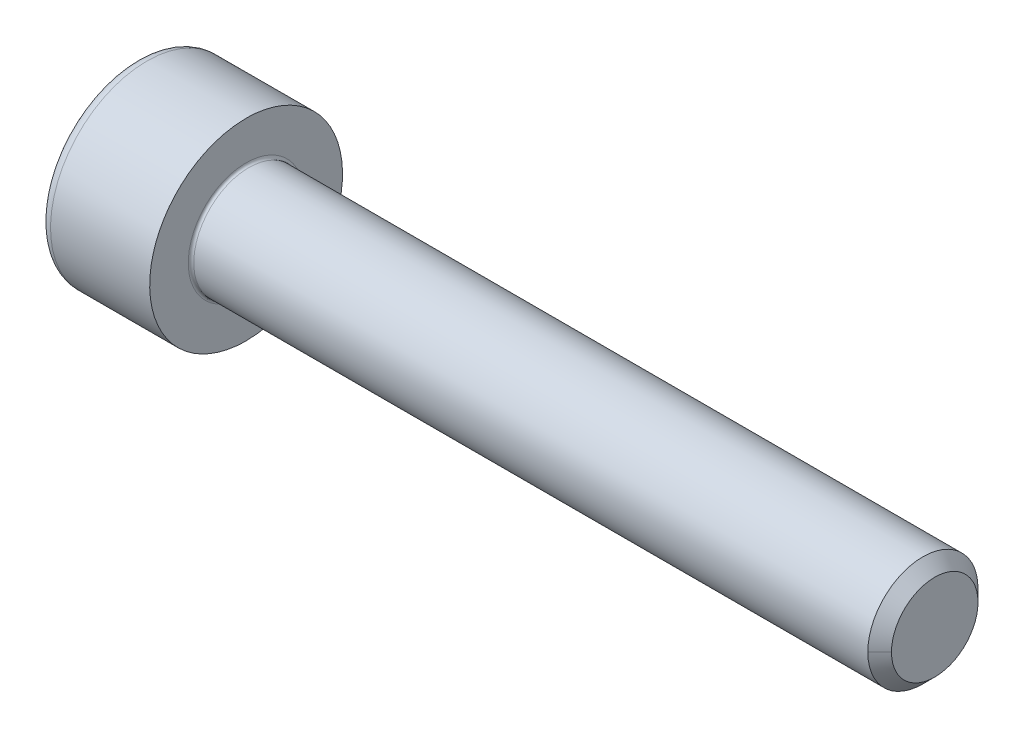
ISO-10303-21;
HEADER;
FILE_DESCRIPTION(('STEP AP214'),'2;1');
FILE_NAME('part.step','',(''),(''),'','','');
FILE_SCHEMA(('AUTOMOTIVE_DESIGN { 1 0 10303 214 1 1 1 1 }'));
ENDSEC;
DATA;
#1=APPLICATION_CONTEXT('core data for automotive mechanical design processes');
#2=APPLICATION_PROTOCOL_DEFINITION('international standard','automotive_design',2000,#1);
#3=PRODUCT_CONTEXT('',#1,'mechanical');
#4=PRODUCT('Part','Part','',(#3));
#5=PRODUCT_RELATED_PRODUCT_CATEGORY('part','',(#4));
#6=PRODUCT_DEFINITION_FORMATION('','',#4);
#7=PRODUCT_DEFINITION_CONTEXT('part definition',#1,'design');
#8=PRODUCT_DEFINITION('design','',#6,#7);
#9=PRODUCT_DEFINITION_SHAPE('','',#8);
#10=(LENGTH_UNIT() NAMED_UNIT(*) SI_UNIT(.MILLI.,.METRE.));
#11=(NAMED_UNIT(*) PLANE_ANGLE_UNIT() SI_UNIT($,.RADIAN.));
#12=(NAMED_UNIT(*) SI_UNIT($,.STERADIAN.) SOLID_ANGLE_UNIT());
#13=UNCERTAINTY_MEASURE_WITH_UNIT(LENGTH_MEASURE(1.E-05),#10,'distance_accuracy_value','');
#14=(GEOMETRIC_REPRESENTATION_CONTEXT(3) GLOBAL_UNCERTAINTY_ASSIGNED_CONTEXT((#13)) GLOBAL_UNIT_ASSIGNED_CONTEXT((#10,
#11,#12)) REPRESENTATION_CONTEXT('',''));
#15=CARTESIAN_POINT('',(0.,0.,0.));
#16=DIRECTION('',(0.,0.,1.));
#17=DIRECTION('',(1.,0.,0.));
#18=AXIS2_PLACEMENT_3D('',#15,#16,#17);
#19=CARTESIAN_POINT('',(-1.,0.,0.));
#20=CARTESIAN_POINT('',(-2.005999996,0.,1.742443106));
#21=(BOUNDED_CURVE() B_SPLINE_CURVE(1,(#19,#20),.UNSPECIFIED.,.F.,
.F.) B_SPLINE_CURVE_WITH_KNOTS((2,2),(0.,1.),
.UNSPECIFIED.) CURVE() GEOMETRIC_REPRESENTATION_ITEM() RATIONAL_B_SPLINE_CURVE((1.,1.)) REPRESENTATION_ITEM(''));
#22=CARTESIAN_POINT('',(997.994,0.,0.));
#23=DIRECTION('',(-1.,0.,0.));
#24=AXIS1_PLACEMENT('',#22,#23);
#25=SURFACE_OF_REVOLUTION('',#21,#24);
#26=CARTESIAN_POINT('',(-1.,0.,0.));
#27=VERTEX_POINT('',#26);
#28=VERTEX_LOOP('',#27);
#29=FACE_BOUND('',#28,.T.);
#30=CARTESIAN_POINT('',(-1.999999988825,-1.5,-0.866025366094797));
#31=CARTESIAN_POINT('',(-1.98388427411064,-1.5,-0.810191489178342));
#32=CARTESIAN_POINT('',(-1.96883726220968,-1.5,-0.754027140575367));
#33=CARTESIAN_POINT('',(-1.94132338547913,-1.5,-0.641014476879999));
#34=CARTESIAN_POINT('',(-1.9288590897329,-1.5,-0.584165539709616));
#35=CARTESIAN_POINT('',(-1.9070072802246,-1.5,-0.469976774400273));
#36=CARTESIAN_POINT('',(-1.89761413319003,-1.5,-0.412638045248085));
#37=CARTESIAN_POINT('',(-1.88230126175624,-1.5,-0.297500282732238));
#38=CARTESIAN_POINT('',(-1.87638124423699,-1.5,-0.23970128863077));
#39=CARTESIAN_POINT('',(-1.86701324338038,-1.5,-0.104714620713106));
#40=CARTESIAN_POINT('',(-1.86502429509298,-1.5,-0.0274188014013972));
#41=CARTESIAN_POINT('',(-1.8679815164406,-1.5,0.127055332262541));
#42=CARTESIAN_POINT('',(-1.87292979645163,-1.5,0.204233603704438));
#43=CARTESIAN_POINT('',(-1.88925859295073,-1.5,0.357837347878237));
#44=CARTESIAN_POINT('',(-1.90063515529884,-1.5,0.434263254027111));
#45=CARTESIAN_POINT('',(-1.92885727236987,-1.5,0.586093369356609));
#46=CARTESIAN_POINT('',(-1.94570378781158,-1.5,0.661497396633531));
#47=CARTESIAN_POINT('',(-1.97026760123469,-1.5,0.758048793201888));
#48=CARTESIAN_POINT('',(-1.97597971174807,-1.5,0.779726485656331));
#49=CARTESIAN_POINT('',(-1.98774144185459,-1.5,0.822959483365519));
#50=CARTESIAN_POINT('',(-1.99379060647347,-1.5,0.844514912309468));
#51=CARTESIAN_POINT('',(-2.00000000500994,-1.5,0.866025422161067));
#52=B_SPLINE_CURVE_WITH_KNOTS('',3,(#30,#31,#32,#33,#34,#35,#36,#37,#38,#39,#40,#41,#42,#43,#44,
#45,#46,#47,#48,#49,#50,#51),.UNSPECIFIED.,.F.,.F.,(4,2,2,2,2,2,2,2,2,2,4),(0.,
0.174360344837175,0.348893305759137,0.523104308736066,0.697300606795078,0.928942731977418,
1.16065534036299,1.39222557351052,1.62383650066837,1.6910881985869,1.75825121782282),.UNSPECIFIED.);
#53=CARTESIAN_POINT('',(-1.99999999692329,-1.50000000789458,-0.866025380474286));
#54=VERTEX_POINT('',#53);
#55=CARTESIAN_POINT('',(-1.99999998782495,-1.49999998368972,0.866025413416744));
#56=VERTEX_POINT('',#55);
#57=EDGE_CURVE('E113',#54,#56,#52,.T.);
#58=ORIENTED_EDGE('',*,*,#57,.T.);
#59=CARTESIAN_POINT('',(-1.99999998892486,-1.49999996747271,0.866025422779641));
#60=CARTESIAN_POINT('',(-1.98388427421516,-1.45164641167563,0.893942361242306));
#61=CARTESIAN_POINT('',(-1.96883726231892,-1.40300665900288,0.922024535548226));
#62=CARTESIAN_POINT('',(-1.94132338559778,-1.30513482130235,0.978530867404776));
#63=CARTESIAN_POINT('',(-1.92885908985622,-1.25590219753923,1.0069553359944));
#64=CARTESIAN_POINT('',(-1.90700728035376,-1.15701182594927,1.06404971866634));
#65=CARTESIAN_POINT('',(-1.89761413332126,-1.10735502987275,1.09271908325535));
#66=CARTESIAN_POINT('',(-1.88230126189328,-1.00764280257917,1.15028796453912));
#67=CARTESIAN_POINT('',(-1.87638124437775,-0.957587405364167,1.17918746160279));
#68=CARTESIAN_POINT('',(-1.86701324353106,-0.840685521745317,1.24668079559571));
#69=CARTESIAN_POINT('',(-1.86502429525114,-0.773745378595099,1.2853287052727));
#70=CARTESIAN_POINT('',(-1.86798151661723,-0.639966854574949,1.36256577214675));
#71=CARTESIAN_POINT('',(-1.87292979663929,-0.573128510866455,1.40115490788864));
#72=CARTESIAN_POINT('',(-1.88925859316082,-0.440103766273083,1.47795678000762));
#73=CARTESIAN_POINT('',(-1.9006351555188,-0.373916990037949,1.51616973309328));
#74=CARTESIAN_POINT('',(-1.92885727260821,-0.242428253098442,1.59208479077961));
#75=CARTESIAN_POINT('',(-1.94570378805829,-0.177126449927273,1.62978680442843));
#76=CARTESIAN_POINT('',(-1.97026760040756,-0.0935104914155066,1.67806250059576));
#77=CARTESIAN_POINT('',(-1.9759797097672,-0.0747370627259536,1.68890134470599));
#78=CARTESIAN_POINT('',(-1.98774143743871,-0.0372961957295007,1.71051783935046));
#79=CARTESIAN_POINT('',(-1.99379060077658,-0.0186286503046706,1.72129555172928));
#80=CARTESIAN_POINT('',(-1.99999999797405,-5.93974909207974E-09,1.73205080457068));
#81=B_SPLINE_CURVE_WITH_KNOTS('',3,(#59,#60,#61,#62,#63,#64,#65,#66,#67,#68,#69,#70,#71,#72,#73,
#74,#75,#76,#77,#78,#79,#80),.UNSPECIFIED.,.F.,.F.,(4,2,2,2,2,2,2,2,2,2,4),(0.,
0.174360344828818,0.348893305742674,0.523104308763315,0.697300606866122,0.928942732131166,
1.16065534060084,1.39222557377756,1.62383650095881,1.69108818570207,1.75825119179746),.UNSPECIFIED.);
#82=CARTESIAN_POINT('',(-1.99999999764269,2.96799540127448E-09,1.73205080628643));
#83=VERTEX_POINT('',#82);
#84=EDGE_CURVE('E109',#56,#83,#81,.T.);
#85=ORIENTED_EDGE('',*,*,#84,.T.);
#86=CARTESIAN_POINT('',(-1.9999999984256,5.93599040248426E-09,1.73205080457285));
#87=CARTESIAN_POINT('',(-1.98388428317016,0.0483535620385735,1.70413386593283));
#88=CARTESIAN_POINT('',(-1.96883727070557,0.0969933150186117,1.67605169144851));
#89=CARTESIAN_POINT('',(-1.94132339281138,0.194865153347467,1.61954535922722));
#90=CARTESIAN_POINT('',(-1.92885909646517,0.244097777431653,1.59112089045123));
#91=CARTESIAN_POINT('',(-1.90700728572809,0.342988149688634,1.53402650739219));
#92=CARTESIAN_POINT('',(-1.89761413806593,0.392644946111129,1.50535714260242));
#93=CARTESIAN_POINT('',(-1.88230126537747,0.492357174126329,1.4477882609));
#94=CARTESIAN_POINT('',(-1.87638124723109,0.542412571716971,1.41888876361845));
#95=CARTESIAN_POINT('',(-1.86701324502738,0.659314455291488,1.35139542964876));
#96=CARTESIAN_POINT('',(-1.86502429593639,0.726254598029126,1.31274752020862));
#97=CARTESIAN_POINT('',(-1.8679815156204,0.860033121288683,1.23551045377099));
#98=CARTESIAN_POINT('',(-1.87292979477107,0.926871464649191,1.19692131822866));
#99=CARTESIAN_POINT('',(-1.88925858957895,1.05989620861809,1.12011944646753));
#100=CARTESIAN_POINT('',(-1.90063515109587,1.12608298457658,1.08190649354025));
#101=CARTESIAN_POINT('',(-1.92885726658604,1.25757172099813,1.00599143615031));
#102=CARTESIAN_POINT('',(-1.94570378127822,1.32287352392794,0.968289422639504));
#103=CARTESIAN_POINT('',(-1.97026759510935,1.40648949029337,0.920013721936166));
#104=CARTESIAN_POINT('',(-1.97597970682344,1.42526292703461,0.909174873176919));
#105=CARTESIAN_POINT('',(-1.98774143949462,1.46270381004559,0.887558369285698));
#106=CARTESIAN_POINT('',(-1.99379060547717,1.48137136343338,0.876780652309082));
#107=CARTESIAN_POINT('',(-2.00000000545143,1.50000001572782,0.866025394889192));
#108=B_SPLINE_CURVE_WITH_KNOTS('',3,(#86,#87,#88,#89,#90,#91,#92,#93,#94,#95,#96,#97,#98,#99,
#100,#101,#102,#103,#104,#105,#106,#107),.UNSPECIFIED.,.F.,.F.,(4,2,2,2,2,2,2,2,2,2,4),(0.,
0.174360346301618,0.348893308693771,0.52310431320544,0.697300612796816,0.928942736706048,
1.1606553438073,1.39222557566018,1.62383650152796,1.69108821504016,1.75825124983545),.UNSPECIFIED.);
#109=CARTESIAN_POINT('',(-1.99999998797798,1.5,0.866025385099705));
#110=VERTEX_POINT('',#109);
#111=EDGE_CURVE('E92',#83,#110,#108,.T.);
#112=ORIENTED_EDGE('',*,*,#111,.T.);
#113=CARTESIAN_POINT('',(-1.99999998923092,1.5,0.866025365941079));
#114=CARTESIAN_POINT('',(-1.98388427451986,1.5,0.810191489053593));
#115=CARTESIAN_POINT('',(-1.96883726262161,1.5,0.754027140479678));
#116=CARTESIAN_POINT('',(-1.94132338589499,1.5,0.64101447684253));
#117=CARTESIAN_POINT('',(-1.92885909014996,1.5,0.584165539701308));
#118=CARTESIAN_POINT('',(-1.90700728063975,1.5,0.469976774437452));
#119=CARTESIAN_POINT('',(-1.89761413360275,1.5,0.412638045301457));
#120=CARTESIAN_POINT('',(-1.88230126216352,1.5,0.297500282817762));
#121=CARTESIAN_POINT('',(-1.87638124464125,1.5,0.239701288732254));
#122=CARTESIAN_POINT('',(-1.86701324377786,1.5,0.104714620864367));
#123=CARTESIAN_POINT('',(-1.86502429548537,1.5,0.0274188015864669));
#124=CARTESIAN_POINT('',(-1.8679815168201,1.5,-0.12705533201076));
#125=CARTESIAN_POINT('',(-1.87292979682335,1.5,-0.204233603419755));
#126=CARTESIAN_POINT('',(-1.88925859330368,1.5,-0.357837347514858));
#127=CARTESIAN_POINT('',(-1.90063515563966,1.5,-0.434263253618061));
#128=CARTESIAN_POINT('',(-1.9288572726839,1.5,-0.586093368856159));
#129=CARTESIAN_POINT('',(-1.94570378811084,1.5,-0.661497396087368));
#130=CARTESIAN_POINT('',(-1.97026760074137,1.5,-0.758048789559621));
#131=CARTESIAN_POINT('',(-1.97597971042608,1.5,-0.779726478977909));
#132=CARTESIAN_POINT('',(-1.98774143878437,1.5,-0.822959470648941));
#133=CARTESIAN_POINT('',(-1.99379060248387,1.5,-0.844514896590837));
#134=CARTESIAN_POINT('',(-2.00000000005964,1.5,-0.866025403452887));
#135=B_SPLINE_CURVE_WITH_KNOTS('',3,(#113,#114,#115,#116,#117,#118,#119,#120,#121,#122,#123,
#124,#125,#126,#127,#128,#129,#130,#131,#132,#133,#134),.UNSPECIFIED.,.F.,.F.,(4,2,2,2,2,2,2,2,
2,2,4),(0.,0.174360344750907,0.348893305586688,0.523104308516857,0.697300606529161,
0.928942731610677,1.16065533989623,1.39222557290333,1.62383649991651,1.69108818839458,
1.758251198215),.UNSPECIFIED.);
#136=CARTESIAN_POINT('',(-1.99999999991955,1.49999999996334,-0.866025404021169));
#137=VERTEX_POINT('',#136);
#138=EDGE_CURVE('E569',#110,#137,#135,.T.);
#139=ORIENTED_EDGE('',*,*,#138,.T.);
#140=CARTESIAN_POINT('',(-2.00000000019314,1.49999999992667,-0.866025404042337));
#141=CARTESIAN_POINT('',(-1.98388428483218,1.45164644376261,-0.893942342715188));
#142=CARTESIAN_POINT('',(-1.96883727225752,1.40300669072079,-0.922024517232485));
#143=CARTESIAN_POINT('',(-1.94132339413591,1.30513485226571,-0.978530849521243));
#144=CARTESIAN_POINT('',(-1.92885909767233,1.25590222811708,-1.00695531833172));
#145=CARTESIAN_POINT('',(-1.90700728669417,1.15701185572053,-1.06404970146588));
#146=CARTESIAN_POINT('',(-1.8976141389087,1.10735505922284,-1.09271906629631));
#147=CARTESIAN_POINT('',(-1.88230126597394,1.00764283105143,-1.1502879480834));
#148=CARTESIAN_POINT('',(-1.87638124770456,0.957587433379773,-1.17918744540897));
#149=CARTESIAN_POINT('',(-1.86701324523704,0.840685549794599,-1.24668077937834));
#150=CARTESIAN_POINT('',(-1.8650242959891,0.773745407125871,-1.285328688775));
#151=CARTESIAN_POINT('',(-1.867981515349,0.639966883991539,-1.36256575513294));
#152=CARTESIAN_POINT('',(-1.87292979433245,0.573128540687341,-1.40115489063907));
#153=CARTESIAN_POINT('',(-1.88925858881171,0.440103796823718,-1.47795676233207));
#154=CARTESIAN_POINT('',(-1.90063515016686,0.373917020914163,-1.51616971522743));
#155=CARTESIAN_POINT('',(-1.92885726534937,0.242428284584089,-1.59208477255729));
#156=CARTESIAN_POINT('',(-1.94570377989565,0.177126481696809,-1.62978678603993));
#157=CARTESIAN_POINT('',(-1.97026759358927,0.0935105152536638,-1.67806248678352));
#158=CARTESIAN_POINT('',(-1.97597970530568,0.074737078393651,-1.6889013356103));
#159=CARTESIAN_POINT('',(-1.98774143798774,0.0372961951460656,-1.71051783963606));
#160=CARTESIAN_POINT('',(-1.99379060397882,0.0186286416404332,-1.72129555667968));
#161=CARTESIAN_POINT('',(-2.00000000396437,-1.07713453244131E-08,-1.73205081416628));
#162=B_SPLINE_CURVE_WITH_KNOTS('',3,(#140,#141,#142,#143,#144,#145,#146,#147,#148,#149,#150,
#151,#152,#153,#154,#155,#156,#157,#158,#159,#160,#161),.UNSPECIFIED.,.F.,.F.,(4,2,2,2,2,2,2,2,
2,2,4),(0.,0.174360346590282,0.348893309272312,0.52310431409702,0.697300614000983,
0.928942737679676,1.16065534454848,1.39222557615577,1.62383650177767,1.69108821568796,
1.75825125088163),.UNSPECIFIED.);
#163=CARTESIAN_POINT('',(-1.99999999602237,-1.19667246999305E-08,-1.73205080119028));
#164=VERTEX_POINT('',#163);
#165=EDGE_CURVE('E564',#137,#164,#162,.T.);
#166=ORIENTED_EDGE('',*,*,#165,.T.);
#167=CARTESIAN_POINT('',(-1.99999999209836,-2.35668203800384E-08,-1.73205079439369));
#168=CARTESIAN_POINT('',(-1.98388427719589,-0.048353579481656,-1.70413385586206));
#169=CARTESIAN_POINT('',(-1.96883726509932,-0.0969933322728545,-1.67605168148677));
#170=CARTESIAN_POINT('',(-1.94132338796567,-0.194865170215148,-1.61954534948866));
#171=CARTESIAN_POINT('',(-1.92885909201194,-0.244097794101594,-1.59112088082683));
#172=CARTESIAN_POINT('',(-1.90700728207943,-0.342988165937472,-1.53402649801092));
#173=CARTESIAN_POINT('',(-1.89761413482855,-0.392644962136499,-1.50535713335017));
#174=CARTESIAN_POINT('',(-1.8823012629632,-0.492357189685322,-1.44778825191702));
#175=CARTESIAN_POINT('',(-1.87638124522866,-0.542412587033059,-1.4188887547757));
#176=CARTESIAN_POINT('',(-1.86701324391044,-0.659314470644279,-1.35139542078482));
#177=CARTESIAN_POINT('',(-1.86502429534868,-0.726254613656709,-1.31274751118603));
#178=CARTESIAN_POINT('',(-1.86798151613053,-0.860033137423459,-1.23551044445558));
#179=CARTESIAN_POINT('',(-1.87292979585002,-0.92687148101635,-1.19692130877907));
#180=CARTESIAN_POINT('',(-1.88925859177779,-1.05989622541351,-1.12011943677069));
#181=CARTESIAN_POINT('',(-1.90063515384598,-1.12608300156788,-1.08190648373031));
#182=CARTESIAN_POINT('',(-1.92885727038624,-1.25757173835857,-1.00599142612725));
#183=CARTESIAN_POINT('',(-1.94570378557717,-1.32287354146165,-0.968289412516415));
#184=CARTESIAN_POINT('',(-1.97026759912438,-1.40648950502681,-0.920013713429813));
#185=CARTESIAN_POINT('',(-1.97597971002549,-1.42526293881191,-0.90917486637729));
#186=CARTESIAN_POINT('',(-1.9877414409606,-1.46270381594273,-0.88755836588098));
#187=CARTESIAN_POINT('',(-1.99379060602025,-1.48137136640645,-0.876780650592578));
#188=CARTESIAN_POINT('',(-2.00000000502158,-1.50000001578917,-0.866025394853775));
#189=B_SPLINE_CURVE_WITH_KNOTS('',3,(#167,#168,#169,#170,#171,#172,#173,#174,#175,#176,#177,
#178,#179,#180,#181,#182,#183,#184,#185,#186,#187,#188),.UNSPECIFIED.,.F.,.F.,(4,2,2,2,2,2,2,2,
2,2,4),(0.,0.174360345382748,0.348893306852326,0.523104310399669,0.697300609028279,
0.928942733842821,1.16065534185683,1.39222557462822,1.62383650141139,1.69108820440079,
1.75825122869657),.UNSPECIFIED.);
#190=EDGE_CURVE('E21',#164,#54,#189,.T.);
#191=ORIENTED_EDGE('',*,*,#190,.T.);
#192=EDGE_LOOP('',(#58,#85,#112,#139,#166,#191));
#193=FACE_BOUND('',#192,.T.);
#194=ADVANCED_FACE('F17',(#29,#193),#25,.F.);
#195=CARTESIAN_POINT('',(-4.,-1.500000019,-0.866025393));
#196=DIRECTION('',(0.,-0.50000000010648,-0.866025403722962));
#197=DIRECTION('',(0.,0.866025403722962,-0.50000000010648));
#198=AXIS2_PLACEMENT_3D('',#195,#196,#197);
#199=PLANE('',#198);
#200=DIRECTION('',(0.,0.866025403722962,-0.500000000106481));
#201=VECTOR('',#200,1.);
#202=CARTESIAN_POINT('',(-4.,-1.50000000158741,-0.866025403053164));
#203=LINE('',#202,#201);
#204=CARTESIAN_POINT('',(-4.,-1.49999999999343,-0.866025403973448));
#205=VERTEX_POINT('',#204);
#206=CARTESIAN_POINT('',(-4.,-3.41378937415882E-11,-1.73205080798029));
#207=VERTEX_POINT('',#206);
#208=EDGE_CURVE('E160',#205,#207,#203,.T.);
#209=ORIENTED_EDGE('',*,*,#208,.F.);
#210=DIRECTION('',(1.,0.,0.));
#211=VECTOR('',#210,1.);
#212=CARTESIAN_POINT('',(-4.,-1.49999999998686,-0.866025403977241));
#213=LINE('',#212,#211);
#214=EDGE_CURVE('E156',#205,#54,#213,.T.);
#215=ORIENTED_EDGE('',*,*,#214,.T.);
#216=ORIENTED_EDGE('',*,*,#190,.F.);
#217=DIRECTION('',(1.,0.,0.));
#218=VECTOR('',#217,1.);
#219=CARTESIAN_POINT('',(-4.,-2.27589214835122E-11,-1.73205080798686));
#220=LINE('',#219,#218);
#221=EDGE_CURVE('E566',#164,#207,#220,.F.);
#222=ORIENTED_EDGE('',*,*,#221,.T.);
#223=EDGE_LOOP('',(#209,#215,#216,#222));
#224=FACE_BOUND('',#223,.T.);
#225=ADVANCED_FACE('F360',(#224),#199,.F.);
#226=CARTESIAN_POINT('',(-4.,-3.3E-08,-1.732050827));
#227=DIRECTION('',(0.,0.500000000070582,-0.866025403743688));
#228=DIRECTION('',(0.,0.866025403743688,0.500000000070582));
#229=AXIS2_PLACEMENT_3D('',#226,#227,#228);
#230=PLANE('',#229);
#231=DIRECTION('',(0.,0.866025403743688,0.500000000070582));
#232=VECTOR('',#231,1.);
#233=CARTESIAN_POINT('',(-4.,-8.5466919999555E-10,-1.73205080844088));
#234=LINE('',#233,#232);
#235=CARTESIAN_POINT('',(-4.,1.5,-0.866025404));
#236=VERTEX_POINT('',#235);
#237=EDGE_CURVE('E163',#207,#236,#234,.T.);
#238=ORIENTED_EDGE('',*,*,#237,.F.);
#239=ORIENTED_EDGE('',*,*,#221,.F.);
#240=ORIENTED_EDGE('',*,*,#165,.F.);
#241=DIRECTION('',(1.,0.,0.));
#242=VECTOR('',#241,1.);
#243=CARTESIAN_POINT('',(-4.,1.5,-0.866025404));
#244=LINE('',#243,#242);
#245=EDGE_CURVE('E104',#137,#236,#244,.F.);
#246=ORIENTED_EDGE('',*,*,#245,.T.);
#247=EDGE_LOOP('',(#238,#239,#240,#246));
#248=FACE_BOUND('',#247,.T.);
#249=ADVANCED_FACE('F349',(#248),#230,.F.);
#250=CARTESIAN_POINT('',(-4.,1.5,-0.866025404));
#251=DIRECTION('',(0.,1.,0.));
#252=DIRECTION('',(0.,0.,1.));
#253=AXIS2_PLACEMENT_3D('',#250,#251,#252);
#254=PLANE('',#253);
#255=DIRECTION('',(0.,0.,1.));
#256=VECTOR('',#255,1.);
#257=CARTESIAN_POINT('',(-4.,1.5,-3.137251144));
#258=LINE('',#257,#256);
#259=CARTESIAN_POINT('',(-4.,1.5,0.866025404113993));
#260=VERTEX_POINT('',#259);
#261=EDGE_CURVE('E166',#236,#260,#258,.T.);
#262=ORIENTED_EDGE('',*,*,#261,.F.);
#263=ORIENTED_EDGE('',*,*,#245,.F.);
#264=ORIENTED_EDGE('',*,*,#138,.F.);
#265=DIRECTION('',(1.,0.,0.));
#266=VECTOR('',#265,1.);
#267=CARTESIAN_POINT('',(-4.,1.5,0.86602540425833));
#268=LINE('',#267,#266);
#269=EDGE_CURVE('E99',#110,#260,#268,.F.);
#270=ORIENTED_EDGE('',*,*,#269,.T.);
#271=EDGE_LOOP('',(#262,#263,#264,#270));
#272=FACE_BOUND('',#271,.T.);
#273=ADVANCED_FACE('F340',(#272),#254,.F.);
#274=CARTESIAN_POINT('',(-4.,1.500000019,0.866025393));
#275=DIRECTION('',(0.,0.50000000010648,0.866025403722962));
#276=DIRECTION('',(0.,-0.866025403722962,0.50000000010648));
#277=AXIS2_PLACEMENT_3D('',#274,#275,#276);
#278=PLANE('',#277);
#279=DIRECTION('',(0.,-0.866025403722962,0.50000000010648));
#280=VECTOR('',#279,1.);
#281=CARTESIAN_POINT('',(-4.,1.49999999890954,0.86602540459923));
#282=LINE('',#281,#280);
#283=CARTESIAN_POINT('',(-4.,0.,1.732050808));
#284=VERTEX_POINT('',#283);
#285=EDGE_CURVE('E169',#260,#284,#282,.T.);
#286=ORIENTED_EDGE('',*,*,#285,.F.);
#287=ORIENTED_EDGE('',*,*,#269,.F.);
#288=ORIENTED_EDGE('',*,*,#111,.F.);
#289=DIRECTION('',(1.,0.,0.));
#290=VECTOR('',#289,1.);
#291=CARTESIAN_POINT('',(-4.,0.,1.732050808));
#292=LINE('',#291,#290);
#293=EDGE_CURVE('E96',#83,#284,#292,.F.);
#294=ORIENTED_EDGE('',*,*,#293,.T.);
#295=EDGE_LOOP('',(#286,#287,#288,#294));
#296=FACE_BOUND('',#295,.T.);
#297=ADVANCED_FACE('F95',(#296),#278,.F.);
#298=CARTESIAN_POINT('',(-4.,0.,1.732050808));
#299=DIRECTION('',(0.,-0.500000000093341,0.866025403730548));
#300=DIRECTION('',(0.,-0.866025403730548,-0.500000000093341));
#301=AXIS2_PLACEMENT_3D('',#298,#299,#300);
#302=PLANE('',#301);
#303=DIRECTION('',(0.,-0.866025403730548,-0.500000000093341));
#304=VECTOR('',#303,1.);
#305=CARTESIAN_POINT('',(-4.,-1.84595394525644E-09,1.73205080693424));
#306=LINE('',#305,#304);
#307=CARTESIAN_POINT('',(-4.,-1.49999999995337,0.866025404026924));
#308=VERTEX_POINT('',#307);
#309=EDGE_CURVE('E111',#284,#308,#306,.T.);
#310=ORIENTED_EDGE('',*,*,#309,.F.);
#311=ORIENTED_EDGE('',*,*,#293,.F.);
#312=ORIENTED_EDGE('',*,*,#84,.F.);
#313=DIRECTION('',(1.,0.,0.));
#314=VECTOR('',#313,1.);
#315=CARTESIAN_POINT('',(-4.,-1.49999999990673,0.866025404053848));
#316=LINE('',#315,#314);
#317=EDGE_CURVE('E153',#56,#308,#316,.F.);
#318=ORIENTED_EDGE('',*,*,#317,.T.);
#319=EDGE_LOOP('',(#310,#311,#312,#318));
#320=FACE_BOUND('',#319,.T.);
#321=ADVANCED_FACE('F107',(#320),#302,.F.);
#322=CARTESIAN_POINT('',(-4.,-1.5,0.866025425));
#323=DIRECTION('',(0.,-1.,0.));
#324=DIRECTION('',(0.,0.,-1.));
#325=AXIS2_PLACEMENT_3D('',#322,#323,#324);
#326=PLANE('',#325);
#327=DIRECTION('',(0.,0.,1.));
#328=VECTOR('',#327,1.);
#329=CARTESIAN_POINT('',(-4.,-1.5,-3.137251144));
#330=LINE('',#329,#328);
#331=EDGE_CURVE('E174',#308,#205,#330,.F.);
#332=ORIENTED_EDGE('',*,*,#331,.F.);
#333=ORIENTED_EDGE('',*,*,#317,.F.);
#334=ORIENTED_EDGE('',*,*,#57,.F.);
#335=ORIENTED_EDGE('',*,*,#214,.F.);
#336=EDGE_LOOP('',(#332,#333,#334,#335));
#337=FACE_BOUND('',#336,.T.);
#338=ADVANCED_FACE('F138',(#337),#326,.F.);
#339=CARTESIAN_POINT('',(-4.,3.137200303,-3.137251144));
#340=DIRECTION('',(-1.,0.,0.));
#341=DIRECTION('',(0.,-1.,0.));
#342=AXIS2_PLACEMENT_3D('',#339,#340,#341);
#343=PLANE('',#342);
#344=ORIENTED_EDGE('',*,*,#309,.T.);
#345=ORIENTED_EDGE('',*,*,#331,.T.);
#346=ORIENTED_EDGE('',*,*,#208,.T.);
#347=ORIENTED_EDGE('',*,*,#237,.T.);
#348=ORIENTED_EDGE('',*,*,#261,.T.);
#349=ORIENTED_EDGE('',*,*,#285,.T.);
#350=EDGE_LOOP('',(#344,#345,#346,#347,#348,#349));
#351=FACE_BOUND('',#350,.T.);
#352=CARTESIAN_POINT('',(-4.,0.,0.));
#353=DIRECTION('',(1.,0.,0.));
#354=DIRECTION('',(0.,1.,0.));
#355=AXIS2_PLACEMENT_3D('',#352,#353,#354);
#356=CIRCLE('',#355,3.1);
#357=CARTESIAN_POINT('',(-4.,3.1,0.));
#358=VERTEX_POINT('',#357);
#359=EDGE_CURVE('E178',#358,#358,#356,.T.);
#360=ORIENTED_EDGE('',*,*,#359,.F.);
#361=EDGE_LOOP('',(#360));
#362=FACE_BOUND('',#361,.T.);
#363=ADVANCED_FACE('F144',(#351,#362),#343,.T.);
#364=CARTESIAN_POINT('',(25.,-1.58943202,-1.58943202));
#365=DIRECTION('',(1.,0.,0.));
#366=DIRECTION('',(0.,1.,0.));
#367=AXIS2_PLACEMENT_3D('',#364,#365,#366);
#368=PLANE('',#367);
#369=CARTESIAN_POINT('',(25.,0.,0.));
#370=DIRECTION('',(-1.,0.,0.));
#371=DIRECTION('',(0.,0.,1.));
#372=AXIS2_PLACEMENT_3D('',#369,#370,#371);
#373=CIRCLE('',#372,1.570585);
#374=CARTESIAN_POINT('',(25.,-5.36887280496646E-10,-1.5705850000092));
#375=VERTEX_POINT('',#374);
#376=CARTESIAN_POINT('',(25.,-4.7009276149962E-11,1.5705850000092));
#377=VERTEX_POINT('',#376);
#378=EDGE_CURVE('E182',#375,#377,#373,.F.);
#379=ORIENTED_EDGE('',*,*,#378,.T.);
#380=CARTESIAN_POINT('',(25.,0.,0.));
#381=DIRECTION('',(-1.,0.,0.));
#382=DIRECTION('',(0.,0.,1.));
#383=AXIS2_PLACEMENT_3D('',#380,#381,#382);
#384=CIRCLE('',#383,1.570585);
#385=EDGE_CURVE('E187',#377,#375,#384,.F.);
#386=ORIENTED_EDGE('',*,*,#385,.T.);
#387=EDGE_LOOP('',(#379,#386));
#388=FACE_BOUND('',#387,.T.);
#389=ADVANCED_FACE('F228',(#388),#368,.T.);
#390=CARTESIAN_POINT('',(-3.6,0.,0.));
#391=DIRECTION('',(1.,0.,0.));
#392=DIRECTION('',(0.,1.,0.));
#393=AXIS2_PLACEMENT_3D('',#390,#391,#392);
#394=TOROIDAL_SURFACE('',#393,3.1,0.399999999999998);
#395=ORIENTED_EDGE('',*,*,#359,.T.);
#396=EDGE_LOOP('',(#395));
#397=FACE_BOUND('',#396,.T.);
#398=CARTESIAN_POINT('',(-3.6,0.,0.));
#399=DIRECTION('',(1.,0.,0.));
#400=DIRECTION('',(0.,1.,0.));
#401=AXIS2_PLACEMENT_3D('',#398,#399,#400);
#402=CIRCLE('',#401,3.5);
#403=CARTESIAN_POINT('',(-3.6,3.5,0.));
#404=VERTEX_POINT('',#403);
#405=EDGE_CURVE('E195',#404,#404,#402,.F.);
#406=ORIENTED_EDGE('',*,*,#405,.T.);
#407=EDGE_LOOP('',(#406));
#408=FACE_BOUND('',#407,.T.);
#409=ADVANCED_FACE('F225',(#397,#408),#394,.T.);
#410=CARTESIAN_POINT('',(25.0001414213562,0.,1.57044357864376));
#411=CARTESIAN_POINT('',(25.,0.,1.570585));
#412=CARTESIAN_POINT('',(24.570585,0.,2.));
#413=(BOUNDED_CURVE() B_SPLINE_CURVE(1,(#410,#411,#412),.UNSPECIFIED.,.F.,
.F.) B_SPLINE_CURVE_WITH_KNOTS((2,1,2),(-0.000329334870768092,5.28601791452819E-11,1.),
.UNSPECIFIED.) CURVE() GEOMETRIC_REPRESENTATION_ITEM() RATIONAL_B_SPLINE_CURVE((1.,1.,1.)) REPRESENTATION_ITEM(''));
#414=CARTESIAN_POINT('',(1024.570585,0.,0.));
#415=DIRECTION('',(-1.,0.,0.));
#416=AXIS1_PLACEMENT('',#414,#415);
#417=SURFACE_OF_REVOLUTION('',#413,#416);
#418=DIRECTION('',(-0.707106781216905,-2.90060050283392E-10,-0.70710678115619));
#419=VECTOR('',#418,1.);
#420=CARTESIAN_POINT('',(24.7853632106781,-7.32310219300384E-10,-1.78522178932188));
#421=LINE('',#420,#419);
#422=CARTESIAN_POINT('',(24.570585,-8.20413714057584E-10,-1.99999999999079));
#423=VERTEX_POINT('',#422);
#424=EDGE_CURVE('E191',#375,#423,#421,.T.);
#425=ORIENTED_EDGE('',*,*,#424,.T.);
#426=CARTESIAN_POINT('',(24.570585,0.,0.));
#427=DIRECTION('',(-1.,0.,0.));
#428=DIRECTION('',(0.,0.,1.));
#429=AXIS2_PLACEMENT_3D('',#426,#427,#428);
#430=CIRCLE('',#429,2.);
#431=CARTESIAN_POINT('',(24.570585,-1.79586368679046E-10,1.99999999999079));
#432=VERTEX_POINT('',#431);
#433=EDGE_CURVE('E199',#423,#432,#430,.F.);
#434=ORIENTED_EDGE('',*,*,#433,.T.);
#435=DIRECTION('',(0.707106781216905,0.,-0.70710678115619));
#436=VECTOR('',#435,1.);
#437=CARTESIAN_POINT('',(24.7853632106781,0.,1.78522178932188));
#438=LINE('',#437,#436);
#439=EDGE_CURVE('E43',#432,#377,#438,.T.);
#440=ORIENTED_EDGE('',*,*,#439,.T.);
#441=ORIENTED_EDGE('',*,*,#378,.F.);
#442=EDGE_LOOP('',(#425,#434,#440,#441));
#443=FACE_BOUND('',#442,.T.);
#444=ADVANCED_FACE('F227',(#443),#417,.T.);
#445=CARTESIAN_POINT('',(25.,0.,1.570585));
#446=CARTESIAN_POINT('',(24.570585,0.,2.));
#447=(BOUNDED_CURVE() B_SPLINE_CURVE(1,(#445,#446),.UNSPECIFIED.,.F.,
.F.) B_SPLINE_CURVE_WITH_KNOTS((2,2),(0.,0.999999999999884),
.UNSPECIFIED.) CURVE() GEOMETRIC_REPRESENTATION_ITEM() RATIONAL_B_SPLINE_CURVE((1.,1.)) REPRESENTATION_ITEM(''));
#448=CARTESIAN_POINT('',(1024.570585,0.,0.));
#449=DIRECTION('',(-1.,0.,0.));
#450=AXIS1_PLACEMENT('',#448,#449);
#451=SURFACE_OF_REVOLUTION('',#447,#450);
#452=ORIENTED_EDGE('',*,*,#385,.F.);
#453=ORIENTED_EDGE('',*,*,#439,.F.);
#454=CARTESIAN_POINT('',(24.570585,0.,0.));
#455=DIRECTION('',(-1.,0.,0.));
#456=DIRECTION('',(0.,0.,1.));
#457=AXIS2_PLACEMENT_3D('',#454,#455,#456);
#458=CIRCLE('',#457,2.);
#459=EDGE_CURVE('E203',#432,#423,#458,.F.);
#460=ORIENTED_EDGE('',*,*,#459,.T.);
#461=ORIENTED_EDGE('',*,*,#424,.F.);
#462=EDGE_LOOP('',(#452,#453,#460,#461));
#463=FACE_BOUND('',#462,.T.);
#464=ADVANCED_FACE('F272',(#463),#451,.T.);
#465=CARTESIAN_POINT('',(-3.6,3.5,0.));
#466=CARTESIAN_POINT('',(0.,3.5,0.));
#467=(BOUNDED_CURVE() B_SPLINE_CURVE(1,(#465,#466),.UNSPECIFIED.,.F.,
.F.) B_SPLINE_CURVE_WITH_KNOTS((2,2),(0.,1.),
.UNSPECIFIED.) CURVE() GEOMETRIC_REPRESENTATION_ITEM() RATIONAL_B_SPLINE_CURVE((1.,1.)) REPRESENTATION_ITEM(''));
#468=CARTESIAN_POINT('',(-2.,0.,0.));
#469=DIRECTION('',(1.,0.,0.));
#470=AXIS1_PLACEMENT('',#468,#469);
#471=SURFACE_OF_REVOLUTION('',#467,#470);
#472=ORIENTED_EDGE('',*,*,#405,.F.);
#473=EDGE_LOOP('',(#472));
#474=FACE_BOUND('',#473,.T.);
#475=CARTESIAN_POINT('',(0.,-3.5,-9.57149708300164E-10));
#476=CARTESIAN_POINT('',(0.,-3.49999941107898,-0.0982690249518444));
#477=CARTESIAN_POINT('',(0.,-3.49585767074426,-0.196556108532977));
#478=CARTESIAN_POINT('',(0.,-3.47931763660928,-0.392451051816578));
#479=CARTESIAN_POINT('',(0.,-3.46691690521581,-0.490058702391783));
#480=CARTESIAN_POINT('',(0.,-3.43391468029313,-0.684046674060502));
#481=CARTESIAN_POINT('',(0.,-3.41330016898935,-0.780424795070314));
#482=CARTESIAN_POINT('',(0.,-3.36401248358081,-0.971155416334155));
#483=CARTESIAN_POINT('',(0.,-3.33533276981902,-1.06550620562325));
#484=CARTESIAN_POINT('',(0.,-3.23759233751382,-1.34410291285236));
#485=CARTESIAN_POINT('',(0.,-3.15675004550912,-1.52436202487919));
#486=CARTESIAN_POINT('',(0.,-2.96590711229957,-1.86872938680329));
#487=CARTESIAN_POINT('',(0.,-2.85590536266211,-2.03283702241247));
#488=CARTESIAN_POINT('',(0.,-2.6715374595476,-2.26331938410765));
#489=CARTESIAN_POINT('',(0.,-2.60680526889871,-2.33757707345027));
#490=CARTESIAN_POINT('',(0.,-2.47136643996144,-2.48032414235418));
#491=CARTESIAN_POINT('',(0.,-2.4006656221146,-2.54881901440596));
#492=CARTESIAN_POINT('',(0.,-2.25371130415047,-2.67963921240491));
#493=CARTESIAN_POINT('',(0.,-2.17745530322259,-2.74196172954419));
#494=CARTESIAN_POINT('',(0.,-2.01997113754352,-2.8599675168154));
#495=CARTESIAN_POINT('',(0.,-1.93874182527359,-2.91564924587941));
#496=CARTESIAN_POINT('',(0.,-1.68847964030786,-3.07207462924424));
#497=CARTESIAN_POINT('',(0.,-1.51271721705648,-3.16233647609784));
#498=CARTESIAN_POINT('',(0.,-1.14862813002374,-3.31201607395511));
#499=CARTESIAN_POINT('',(0.,-0.960301600457152,-3.37143415438461));
#500=CARTESIAN_POINT('',(0.,-0.576321833007905,-3.45782557295744));
#501=CARTESIAN_POINT('',(0.,-0.380668556003053,-3.48479873783114));
#502=CARTESIAN_POINT('',(0.,0.0123891378747153,-3.50550671115913));
#503=CARTESIAN_POINT('',(0.,0.209793554747632,-3.49924151961341));
#504=CARTESIAN_POINT('',(0.,0.600725393781994,-3.45367578421269));
#505=CARTESIAN_POINT('',(0.,0.794252836642405,-3.41437541677893));
#506=CARTESIAN_POINT('',(0.,1.17205423797395,-3.30378180727562));
#507=CARTESIAN_POINT('',(0.,1.35632809758837,-3.232488223501));
#508=CARTESIAN_POINT('',(0.,1.62164155869789,-3.10322558721828));
#509=CARTESIAN_POINT('',(0.,1.70827206007419,-3.05638743658555));
#510=CARTESIAN_POINT('',(0.,1.87728409789105,-2.95558287645982));
#511=CARTESIAN_POINT('',(0.,1.95966661356703,-2.90161812008134));
#512=CARTESIAN_POINT('',(0.,2.11955359530764,-2.78696364418675));
#513=CARTESIAN_POINT('',(0.,2.19706025319761,-2.72627698070683));
#514=CARTESIAN_POINT('',(0.,2.34674873397885,-2.59855164733107));
#515=CARTESIAN_POINT('',(0.,2.41892534578424,-2.53150690375635));
#516=CARTESIAN_POINT('',(0.,2.62649099214301,-2.32167329061705));
#517=CARTESIAN_POINT('',(0.,2.7531277144418,-2.17003278958265));
#518=CARTESIAN_POINT('',(0.,2.97909923582278,-1.84762500952865));
#519=CARTESIAN_POINT('',(0.,3.07843507265389,-1.67685845786723));
#520=CARTESIAN_POINT('',(0.,3.20490851921885,-1.410074304102));
#521=CARTESIAN_POINT('',(0.,3.24334355925271,-1.31925940929625));
#522=CARTESIAN_POINT('',(0.,3.31239978726745,-1.13476365543397));
#523=CARTESIAN_POINT('',(0.,3.34302729891943,-1.04108518503792));
#524=CARTESIAN_POINT('',(0.,3.39623049374026,-0.851638886412467));
#525=CARTESIAN_POINT('',(0.,3.41881889144042,-0.755874613955554));
#526=CARTESIAN_POINT('',(0.,3.45585140742439,-0.562802103501639));
#527=CARTESIAN_POINT('',(0.,3.47029792783269,-0.465494329609091));
#528=CARTESIAN_POINT('',(0.,3.4870777758769,-0.306696447321248));
#529=CARTESIAN_POINT('',(0.,3.49192207642766,-0.245460585568614));
#530=CARTESIAN_POINT('',(0.,3.49838337250123,-0.122818833724777));
#531=CARTESIAN_POINT('',(0.,3.50000036802403,-0.0614129436335734));
#532=CARTESIAN_POINT('',(0.,3.49999941111173,0.0982690237847136));
#533=CARTESIAN_POINT('',(0.,3.4958576708098,0.196556107366953));
#534=CARTESIAN_POINT('',(0.,3.47931763674024,0.392451050655589));
#535=CARTESIAN_POINT('',(0.,3.46691690537936,0.49005870123472));
#536=CARTESIAN_POINT('',(0.,3.43391468052142,0.684046672914543));
#537=CARTESIAN_POINT('',(0.,3.41330016924973,0.78042479393153));
#538=CARTESIAN_POINT('',(0.,3.36401248390468,0.971155415212343));
#539=CARTESIAN_POINT('',(0.,3.33533277017427,1.06550620451124));
#540=CARTESIAN_POINT('',(0.,3.23759233796186,1.34410291177315));
#541=CARTESIAN_POINT('',(0.,3.15675004601725,1.52436202382692));
#542=CARTESIAN_POINT('',(0.,2.9659071129225,1.86872938581464));
#543=CARTESIAN_POINT('',(0.,2.85590536333973,2.03283702146049));
#544=CARTESIAN_POINT('',(0.,2.67153746030205,2.26331938321713));
#545=CARTESIAN_POINT('',(0.,2.60680526967792,2.33757707258131));
#546=CARTESIAN_POINT('',(0.,2.47136644078826,2.48032414153035));
#547=CARTESIAN_POINT('',(0.,2.40066562296426,2.54881901360568));
#548=CARTESIAN_POINT('',(0.,2.25371130504375,2.67963921165362));
#549=CARTESIAN_POINT('',(0.,2.17745530413663,2.74196172881833));
#550=CARTESIAN_POINT('',(0.,2.01997113849686,2.85996751614206));
#551=CARTESIAN_POINT('',(0.,1.93874182624549,2.91564924523315));
#552=CARTESIAN_POINT('',(0.,1.68847964133188,3.07207462868142));
#553=CARTESIAN_POINT('',(0.,1.51271721811058,3.16233647559361));
#554=CARTESIAN_POINT('',(0.,1.14862813112773,3.31201607357224));
#555=CARTESIAN_POINT('',(0.,0.960301601580955,3.37143415406451));
#556=CARTESIAN_POINT('',(0.,0.576321834160512,3.45782557276533));
#557=CARTESIAN_POINT('',(0.,0.380668557164653,3.48479873770425));
#558=CARTESIAN_POINT('',(0.,-0.0123891367062125,3.50550671116326));
#559=CARTESIAN_POINT('',(0.,-0.209793553581219,3.49924151968334));
#560=CARTESIAN_POINT('',(0.,-0.600725392630778,3.45367578441293));
#561=CARTESIAN_POINT('',(0.,-0.794252835504295,3.41437541704368));
#562=CARTESIAN_POINT('',(0.,-1.1720542368727,3.3037818076663));
#563=CARTESIAN_POINT('',(0.,-1.35632809651088,3.2324882239531));
#564=CARTESIAN_POINT('',(0.,-1.62164155766347,3.10322558775883));
#565=CARTESIAN_POINT('',(0.,-1.70827205905537,3.05638743715499));
#566=CARTESIAN_POINT('',(0.,-1.8772840969058,2.95558287708562));
#567=CARTESIAN_POINT('',(0.,-1.95966661259976,2.9016181207346));
#568=CARTESIAN_POINT('',(0.,-2.11955359437859,2.78696364489331));
#569=CARTESIAN_POINT('',(0.,-2.19706025228881,2.72627698143922));
#570=CARTESIAN_POINT('',(0.,-2.34674873311265,2.59855164811334));
#571=CARTESIAN_POINT('',(0.,-2.4189253449404,2.53150690456267));
#572=CARTESIAN_POINT('',(0.,-2.62649099136911,2.32167329149255));
#573=CARTESIAN_POINT('',(0.,-2.75312771371844,2.17003279050038));
#574=CARTESIAN_POINT('',(0.,-2.97909923520689,1.8476250105217));
#575=CARTESIAN_POINT('',(0.,-3.07843507209493,1.67685845889338));
#576=CARTESIAN_POINT('',(0.,-3.20490851874872,1.41007430517052));
#577=CARTESIAN_POINT('',(0.,-3.24334355881277,1.31925941037783));
#578=CARTESIAN_POINT('',(0.,-3.31239978688885,1.13476365653909));
#579=CARTESIAN_POINT('',(0.,-3.34302729857199,1.04108518615354));
#580=CARTESIAN_POINT('',(0.,-3.39623049345603,0.851638887545939));
#581=CARTESIAN_POINT('',(0.,-3.4188188911882,0.755874615096356));
#582=CARTESIAN_POINT('',(0.,-3.45585140723668,0.56280210465432));
#583=CARTESIAN_POINT('',(0.,-3.47029792767747,0.465494330766318));
#584=CARTESIAN_POINT('',(0.,-3.48707777581553,0.306696448096861));
#585=CARTESIAN_POINT('',(0.,-3.4919220764072,0.245460585956959));
#586=CARTESIAN_POINT('',(0.,-3.49838337252169,0.122818833336432));
#587=CARTESIAN_POINT('',(0.,-3.5000003680445,0.0614129428558054));
#588=CARTESIAN_POINT('',(0.,-3.5,-9.57149708300164E-10));
#589=B_SPLINE_CURVE_WITH_KNOTS('',3,(#475,#476,#477,#478,#479,#480,#481,#482,#483,#484,#485,
#486,#487,#488,#489,#490,#491,#492,#493,#494,#495,#496,#497,#498,#499,#500,#501,#502,#503,#504,
#505,#506,#507,#508,#509,#510,#511,#512,#513,#514,#515,#516,#517,#518,#519,#520,#521,#522,#523,
#524,#525,#526,#527,#528,#529,#530,#531,#532,#533,#534,#535,#536,#537,#538,#539,#540,#541,#542,
#543,#544,#545,#546,#547,#548,#549,#550,#551,#552,#553,#554,#555,#556,#557,#558,#559,#560,#561,
#562,#563,#564,#565,#566,#567,#568,#569,#570,#571,#572,#573,#574,#575,#576,#577,#578,#579,#580,
#581,#582,#583,#584,#585,#586,#587,#588),.UNSPECIFIED.,.T.,.F.,(4,2,2,2,2,2,2,2,2,2,2,2,2,2,2,2,
2,2,2,2,2,2,2,2,2,2,2,2,2,2,2,2,2,2,2,2,2,2,2,2,2,2,2,2,2,2,2,2,2,2,2,2,2,2,2,2,4),(0.,
0.294750535548633,0.589588103579842,0.884894821466402,1.18044168221319,1.77012656673903,
2.35983387005365,2.65507389014641,2.95002925439208,3.24511823094428,3.54027555344188,
4.12997479655938,4.71966774128374,5.30936383520473,5.89905992912572,6.48875287385007,
7.07845211696759,7.37360943946523,7.66869841601748,7.9636537802631,8.25889380035581,
8.84860110367047,9.43828598819627,9.73383284894381,10.0291395668313,10.3239771348619,
10.6187276704095,10.8029311683994,10.9871346663893,11.2818852019369,11.5767227699675,
11.872029487855,12.1675763486025,12.7572612331283,13.346968536443,13.6422085565357,
13.9371639207813,14.2322528973336,14.5274102198312,15.1171094629487,15.7068024076731,
16.2964985015941,16.8861945955151,17.4758875402394,18.0655867833569,18.3607441058545,
18.6558330824067,18.9507884466524,19.2460284667451,19.8357357700598,20.4254206545856,
20.7209675153324,21.016274233219,21.3111118012502,21.6058623367988,21.790065835955,
21.9742693351112),.UNSPECIFIED.);
#590=CARTESIAN_POINT('',(0.,-3.5,-9.57149708300164E-10));
#591=VERTEX_POINT('',#590);
#592=EDGE_CURVE('E206',#591,#591,#589,.T.);
#593=ORIENTED_EDGE('',*,*,#592,.F.);
#594=EDGE_LOOP('',(#593));
#595=FACE_BOUND('',#594,.T.);
#596=ADVANCED_FACE('F214',(#474,#595),#471,.T.);
#597=CARTESIAN_POINT('',(0.1,2.,0.));
#598=CARTESIAN_POINT('',(24.570585,2.,0.));
#599=(BOUNDED_CURVE() B_SPLINE_CURVE(1,(#597,#598),.UNSPECIFIED.,.F.,
.F.) B_SPLINE_CURVE_WITH_KNOTS((2,2),(0.,1.),
.UNSPECIFIED.) CURVE() GEOMETRIC_REPRESENTATION_ITEM() RATIONAL_B_SPLINE_CURVE((1.,1.)) REPRESENTATION_ITEM(''));
#600=CARTESIAN_POINT('',(15.,0.,0.));
#601=DIRECTION('',(1.,0.,0.));
#602=AXIS1_PLACEMENT('',#600,#601);
#603=SURFACE_OF_REVOLUTION('',#599,#602);
#604=ORIENTED_EDGE('',*,*,#433,.F.);
#605=ORIENTED_EDGE('',*,*,#459,.F.);
#606=EDGE_LOOP('',(#604,#605));
#607=FACE_BOUND('',#606,.T.);
#608=CARTESIAN_POINT('',(0.0999999999999978,0.,0.));
#609=DIRECTION('',(1.,0.,0.));
#610=DIRECTION('',(0.,0.,-1.));
#611=AXIS2_PLACEMENT_3D('',#608,#609,#610);
#612=CIRCLE('',#611,2.);
#613=CARTESIAN_POINT('',(0.0999999999999978,0.,-2.));
#614=VERTEX_POINT('',#613);
#615=EDGE_CURVE('E34',#614,#614,#612,.T.);
#616=ORIENTED_EDGE('',*,*,#615,.T.);
#617=EDGE_LOOP('',(#616));
#618=FACE_BOUND('',#617,.T.);
#619=ADVANCED_FACE('F223',(#607,#618),#603,.T.);
#620=CARTESIAN_POINT('',(0.,-3.542,-3.542));
#621=DIRECTION('',(1.,0.,0.));
#622=DIRECTION('',(0.,1.,0.));
#623=AXIS2_PLACEMENT_3D('',#620,#621,#622);
#624=PLANE('',#623);
#625=CARTESIAN_POINT('',(0.,0.,0.));
#626=DIRECTION('',(1.,0.,0.));
#627=DIRECTION('',(0.,0.,-1.));
#628=AXIS2_PLACEMENT_3D('',#625,#626,#627);
#629=CIRCLE('',#628,2.1);
#630=CARTESIAN_POINT('',(0.,0.,-2.1));
#631=VERTEX_POINT('',#630);
#632=EDGE_CURVE('E11',#631,#631,#629,.F.);
#633=ORIENTED_EDGE('',*,*,#632,.T.);
#634=EDGE_LOOP('',(#633));
#635=FACE_BOUND('',#634,.T.);
#636=ORIENTED_EDGE('',*,*,#592,.T.);
#637=EDGE_LOOP('',(#636));
#638=FACE_BOUND('',#637,.T.);
#639=ADVANCED_FACE('F219',(#635,#638),#624,.T.);
#640=CARTESIAN_POINT('',(0.0999999999999978,0.,0.));
#641=DIRECTION('',(1.,0.,0.));
#642=DIRECTION('',(0.,0.,-1.));
#643=AXIS2_PLACEMENT_3D('',#640,#641,#642);
#644=TOROIDAL_SURFACE('',#643,2.1,0.0999999999999988);
#645=ORIENTED_EDGE('',*,*,#632,.F.);
#646=EDGE_LOOP('',(#645));
#647=FACE_BOUND('',#646,.T.);
#648=ORIENTED_EDGE('',*,*,#615,.F.);
#649=EDGE_LOOP('',(#648));
#650=FACE_BOUND('',#649,.T.);
#651=ADVANCED_FACE('F19',(#647,#650),#644,.F.);
#652=CLOSED_SHELL('',(#194,#225,#249,#273,#297,#321,#338,#363,#389,#409,#444,#464,#596,#619,
#639,#651));
#653=MANIFOLD_SOLID_BREP('B1',#652);
#654=ADVANCED_BREP_SHAPE_REPRESENTATION('',(#18,#653),#14);
#655=SHAPE_DEFINITION_REPRESENTATION(#9,#654);
ENDSEC;
END-ISO-10303-21;
